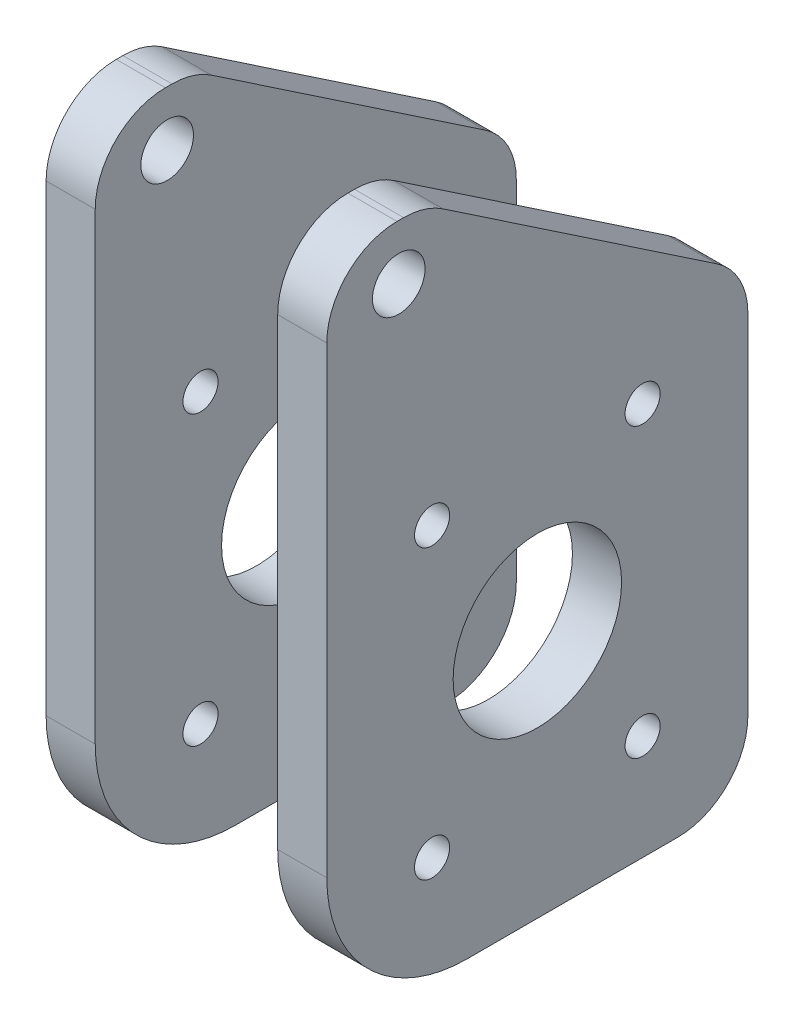
ISO-10303-21;
HEADER;
FILE_DESCRIPTION(('STEP AP214'),'2;1');
FILE_NAME('part.step','',(''),(''),'','','');
FILE_SCHEMA(('AUTOMOTIVE_DESIGN { 1 0 10303 214 1 1 1 1 }'));
ENDSEC;
DATA;
#1=APPLICATION_CONTEXT('core data for automotive mechanical design processes');
#2=APPLICATION_PROTOCOL_DEFINITION('international standard','automotive_design',2000,#1);
#3=PRODUCT_CONTEXT('',#1,'mechanical');
#4=PRODUCT('Part','Part','',(#3));
#5=PRODUCT_RELATED_PRODUCT_CATEGORY('part','',(#4));
#6=PRODUCT_DEFINITION_FORMATION('','',#4);
#7=PRODUCT_DEFINITION_CONTEXT('part definition',#1,'design');
#8=PRODUCT_DEFINITION('design','',#6,#7);
#9=PRODUCT_DEFINITION_SHAPE('','',#8);
#10=(LENGTH_UNIT() NAMED_UNIT(*) SI_UNIT(.MILLI.,.METRE.));
#11=(NAMED_UNIT(*) PLANE_ANGLE_UNIT() SI_UNIT($,.RADIAN.));
#12=(NAMED_UNIT(*) SI_UNIT($,.STERADIAN.) SOLID_ANGLE_UNIT());
#13=UNCERTAINTY_MEASURE_WITH_UNIT(LENGTH_MEASURE(1.E-05),#10,'distance_accuracy_value','');
#14=(GEOMETRIC_REPRESENTATION_CONTEXT(3) GLOBAL_UNCERTAINTY_ASSIGNED_CONTEXT((#13)) GLOBAL_UNIT_ASSIGNED_CONTEXT((#10,
#11,#12)) REPRESENTATION_CONTEXT('',''));
#15=CARTESIAN_POINT('',(0.,0.,0.));
#16=DIRECTION('',(0.,0.,1.));
#17=DIRECTION('',(1.,0.,0.));
#18=AXIS2_PLACEMENT_3D('',#15,#16,#17);
#19=CARTESIAN_POINT('',(2266.95171276937,408.837981043394,480.41287818477));
#20=DIRECTION('',(0.,1.,0.));
#21=DIRECTION('',(0.,0.,1.));
#22=AXIS2_PLACEMENT_3D('',#19,#20,#21);
#23=PLANE('',#22);
#24=DIRECTION('',(1.,0.,0.));
#25=VECTOR('',#24,1.);
#26=CARTESIAN_POINT('',(2266.95171276937,408.837981043394,493.11287818477));
#27=LINE('',#26,#25);
#28=CARTESIAN_POINT('',(2266.95171276937,408.837981043394,493.11287818477));
#29=VERTEX_POINT('',#28);
#30=CARTESIAN_POINT('',(2275.84171276937,408.837981043394,493.11287818477));
#31=VERTEX_POINT('',#30);
#32=EDGE_CURVE('E60',#29,#31,#27,.T.);
#33=ORIENTED_EDGE('',*,*,#32,.T.);
#34=DIRECTION('',(0.,0.,-1.));
#35=VECTOR('',#34,1.);
#36=CARTESIAN_POINT('',(2275.84171276937,408.837981043394,576.51414081052));
#37=LINE('',#36,#35);
#38=CARTESIAN_POINT('',(2275.84171276937,408.837981043394,531.21287818477));
#39=VERTEX_POINT('',#38);
#40=EDGE_CURVE('E12',#39,#31,#37,.T.);
#41=ORIENTED_EDGE('',*,*,#40,.F.);
#42=DIRECTION('',(1.,0.,0.));
#43=VECTOR('',#42,1.);
#44=CARTESIAN_POINT('',(2266.95171276937,408.837981043394,531.21287818477));
#45=LINE('',#44,#43);
#46=CARTESIAN_POINT('',(2266.95171276937,408.837981043394,531.21287818477));
#47=VERTEX_POINT('',#46);
#48=EDGE_CURVE('E143',#39,#47,#45,.F.);
#49=ORIENTED_EDGE('',*,*,#48,.T.);
#50=DIRECTION('',(0.,0.,1.));
#51=VECTOR('',#50,1.);
#52=CARTESIAN_POINT('',(2266.95171276937,408.837981043394,480.41287818477));
#53=LINE('',#52,#51);
#54=EDGE_CURVE('E220',#29,#47,#53,.T.);
#55=ORIENTED_EDGE('',*,*,#54,.F.);
#56=EDGE_LOOP('',(#33,#41,#49,#55));
#57=FACE_BOUND('',#56,.T.);
#58=ADVANCED_FACE('F57',(#57),#23,.F.);
#59=CARTESIAN_POINT('',(2266.95171276937,408.837981043394,556.61287818477));
#60=DIRECTION('',(0.,0.,-1.));
#61=DIRECTION('',(0.,1.,0.));
#62=AXIS2_PLACEMENT_3D('',#59,#60,#61);
#63=PLANE('',#62);
#64=DIRECTION('',(1.,0.,0.));
#65=VECTOR('',#64,1.);
#66=CARTESIAN_POINT('',(2266.95171276937,434.237981043394,556.61287818477));
#67=LINE('',#66,#65);
#68=CARTESIAN_POINT('',(2266.95171276937,434.237981043394,556.61287818477));
#69=VERTEX_POINT('',#68);
#70=CARTESIAN_POINT('',(2275.84171276937,434.237981043394,556.61287818477));
#71=VERTEX_POINT('',#70);
#72=EDGE_CURVE('E136',#69,#71,#67,.T.);
#73=ORIENTED_EDGE('',*,*,#72,.T.);
#74=DIRECTION('',(0.,1.,0.));
#75=VECTOR('',#74,1.);
#76=CARTESIAN_POINT('',(2275.84171276937,408.837981043394,556.61287818477));
#77=LINE('',#76,#75);
#78=CARTESIAN_POINT('',(2275.84171276937,518.057981043394,556.61287818477));
#79=VERTEX_POINT('',#78);
#80=EDGE_CURVE('E127',#71,#79,#77,.T.);
#81=ORIENTED_EDGE('',*,*,#80,.T.);
#82=DIRECTION('',(1.,0.,0.));
#83=VECTOR('',#82,1.);
#84=CARTESIAN_POINT('',(2266.95171276937,518.057981043394,556.61287818477));
#85=LINE('',#84,#83);
#86=CARTESIAN_POINT('',(2266.95171276937,518.057981043394,556.61287818477));
#87=VERTEX_POINT('',#86);
#88=EDGE_CURVE('E135',#79,#87,#85,.F.);
#89=ORIENTED_EDGE('',*,*,#88,.T.);
#90=DIRECTION('',(0.,1.,0.));
#91=VECTOR('',#90,1.);
#92=CARTESIAN_POINT('',(2266.95171276937,408.837981043394,556.61287818477));
#93=LINE('',#92,#91);
#94=EDGE_CURVE('E148',#69,#87,#93,.T.);
#95=ORIENTED_EDGE('',*,*,#94,.F.);
#96=EDGE_LOOP('',(#73,#81,#89,#95));
#97=FACE_BOUND('',#96,.T.);
#98=ADVANCED_FACE('F146',(#97),#63,.F.);
#99=CARTESIAN_POINT('',(2266.95171276937,530.757981043394,556.61287818477));
#100=DIRECTION('',(0.,-1.,0.));
#101=DIRECTION('',(0.,0.,-1.));
#102=AXIS2_PLACEMENT_3D('',#99,#100,#101);
#103=PLANE('',#102);
#104=DIRECTION('',(1.,0.,0.));
#105=VECTOR('',#104,1.);
#106=CARTESIAN_POINT('',(2266.95171276937,530.757981043394,543.91287818477));
#107=LINE('',#106,#105);
#108=CARTESIAN_POINT('',(2266.95171276937,530.757981043394,543.91287818477));
#109=VERTEX_POINT('',#108);
#110=CARTESIAN_POINT('',(2275.84171276937,530.757981043394,543.91287818477));
#111=VERTEX_POINT('',#110);
#112=EDGE_CURVE('E154',#109,#111,#107,.T.);
#113=ORIENTED_EDGE('',*,*,#112,.T.);
#114=DIRECTION('',(0.,0.,-1.));
#115=VECTOR('',#114,1.);
#116=CARTESIAN_POINT('',(2275.84171276937,530.757981043394,576.51414081052));
#117=LINE('',#116,#115);
#118=CARTESIAN_POINT('',(2275.84171276937,530.757981043394,542.712815443371));
#119=VERTEX_POINT('',#118);
#120=EDGE_CURVE('E158',#111,#119,#117,.T.);
#121=ORIENTED_EDGE('',*,*,#120,.T.);
#122=DIRECTION('',(1.,0.,0.));
#123=VECTOR('',#122,1.);
#124=CARTESIAN_POINT('',(2266.95171276937,530.757981043394,542.712815443371));
#125=LINE('',#124,#123);
#126=CARTESIAN_POINT('',(2266.95171276937,530.757981043394,542.712815443371));
#127=VERTEX_POINT('',#126);
#128=EDGE_CURVE('E155',#119,#127,#125,.F.);
#129=ORIENTED_EDGE('',*,*,#128,.T.);
#130=DIRECTION('',(0.,0.,-1.));
#131=VECTOR('',#130,1.);
#132=CARTESIAN_POINT('',(2266.95171276937,530.757981043394,556.61287818477));
#133=LINE('',#132,#131);
#134=EDGE_CURVE('E204',#109,#127,#133,.T.);
#135=ORIENTED_EDGE('',*,*,#134,.F.);
#136=EDGE_LOOP('',(#113,#121,#129,#135));
#137=FACE_BOUND('',#136,.T.);
#138=ADVANCED_FACE('F190',(#137),#103,.F.);
#139=CARTESIAN_POINT('',(2266.95171276937,530.757981043394,538.83287818477));
#140=DIRECTION('',(0.,-0.829266427591158,0.558853462072303));
#141=DIRECTION('',(0.,-0.558853462072303,-0.829266427591158));
#142=AXIS2_PLACEMENT_3D('',#139,#140,#141);
#143=PLANE('',#142);
#144=DIRECTION('',(1.,0.,0.));
#145=VECTOR('',#144,1.);
#146=CARTESIAN_POINT('',(2266.95171276937,528.589664673802,535.615376475052));
#147=LINE('',#146,#145);
#148=CARTESIAN_POINT('',(2266.95171276937,528.589664673802,535.615376475052));
#149=VERTEX_POINT('',#148);
#150=CARTESIAN_POINT('',(2275.84171276937,528.589664673802,535.615376475052));
#151=VERTEX_POINT('',#150);
#152=EDGE_CURVE('E157',#149,#151,#147,.T.);
#153=ORIENTED_EDGE('',*,*,#152,.T.);
#154=DIRECTION('',(0.,-0.558853462072303,-0.829266427591158));
#155=VECTOR('',#154,1.);
#156=CARTESIAN_POINT('',(2275.84171276937,530.757981043394,538.83287818477));
#157=LINE('',#156,#155);
#158=CARTESIAN_POINT('',(2275.84171276937,495.163619999528,486.015439216452));
#159=VERTEX_POINT('',#158);
#160=EDGE_CURVE('E164',#151,#159,#157,.T.);
#161=ORIENTED_EDGE('',*,*,#160,.T.);
#162=DIRECTION('',(1.,0.,0.));
#163=VECTOR('',#162,1.);
#164=CARTESIAN_POINT('',(2266.95171276937,495.163619999528,486.015439216452));
#165=LINE('',#164,#163);
#166=CARTESIAN_POINT('',(2266.95171276937,495.163619999528,486.015439216452));
#167=VERTEX_POINT('',#166);
#168=EDGE_CURVE('E161',#159,#167,#165,.F.);
#169=ORIENTED_EDGE('',*,*,#168,.T.);
#170=DIRECTION('',(0.,-0.558853462072303,-0.829266427591158));
#171=VECTOR('',#170,1.);
#172=CARTESIAN_POINT('',(2266.95171276937,530.757981043394,538.83287818477));
#173=LINE('',#172,#171);
#174=EDGE_CURVE('E203',#149,#167,#173,.T.);
#175=ORIENTED_EDGE('',*,*,#174,.F.);
#176=EDGE_LOOP('',(#153,#161,#169,#175));
#177=FACE_BOUND('',#176,.T.);
#178=ADVANCED_FACE('F275',(#177),#143,.F.);
#179=CARTESIAN_POINT('',(2266.95171276937,491.387981043394,480.41287818477));
#180=DIRECTION('',(0.,0.,1.));
#181=DIRECTION('',(0.,-1.,0.));
#182=AXIS2_PLACEMENT_3D('',#179,#180,#181);
#183=PLANE('',#182);
#184=DIRECTION('',(1.,0.,0.));
#185=VECTOR('',#184,1.);
#186=CARTESIAN_POINT('',(2266.95171276937,484.63193636912,480.41287818477));
#187=LINE('',#186,#185);
#188=CARTESIAN_POINT('',(2266.95171276937,484.63193636912,480.41287818477));
#189=VERTEX_POINT('',#188);
#190=CARTESIAN_POINT('',(2275.84171276937,484.63193636912,480.41287818477));
#191=VERTEX_POINT('',#190);
#192=EDGE_CURVE('E163',#189,#191,#187,.T.);
#193=ORIENTED_EDGE('',*,*,#192,.T.);
#194=DIRECTION('',(0.,-1.,0.));
#195=VECTOR('',#194,1.);
#196=CARTESIAN_POINT('',(2275.84171276937,491.387981043394,480.41287818477));
#197=LINE('',#196,#195);
#198=CARTESIAN_POINT('',(2275.84171276937,421.537981043394,480.41287818477));
#199=VERTEX_POINT('',#198);
#200=EDGE_CURVE('E169',#191,#199,#197,.T.);
#201=ORIENTED_EDGE('',*,*,#200,.T.);
#202=DIRECTION('',(1.,0.,0.));
#203=VECTOR('',#202,1.);
#204=CARTESIAN_POINT('',(2266.95171276937,421.537981043394,480.41287818477));
#205=LINE('',#204,#203);
#206=CARTESIAN_POINT('',(2266.95171276937,421.537981043394,480.41287818477));
#207=VERTEX_POINT('',#206);
#208=EDGE_CURVE('E167',#199,#207,#205,.F.);
#209=ORIENTED_EDGE('',*,*,#208,.T.);
#210=DIRECTION('',(0.,-1.,0.));
#211=VECTOR('',#210,1.);
#212=CARTESIAN_POINT('',(2266.95171276937,491.387981043394,480.41287818477));
#213=LINE('',#212,#211);
#214=EDGE_CURVE('E214',#189,#207,#213,.T.);
#215=ORIENTED_EDGE('',*,*,#214,.F.);
#216=EDGE_LOOP('',(#193,#201,#209,#215));
#217=FACE_BOUND('',#216,.T.);
#218=ADVANCED_FACE('F270',(#217),#183,.F.);
#219=CARTESIAN_POINT('',(2266.95171276937,479.957981043394,537.56287818477));
#220=DIRECTION('',(1.,0.,0.));
#221=DIRECTION('',(0.,0.,-1.));
#222=AXIS2_PLACEMENT_3D('',#219,#220,#221);
#223=CYLINDRICAL_SURFACE('',#222,3.17499999999997);
#224=CARTESIAN_POINT('',(2275.84171276937,479.957981043394,537.56287818477));
#225=DIRECTION('',(-1.,0.,0.));
#226=DIRECTION('',(0.,0.,1.));
#227=AXIS2_PLACEMENT_3D('',#224,#225,#226);
#228=CIRCLE('',#227,3.17499999999997);
#229=CARTESIAN_POINT('',(2275.84171276937,479.957981043394,540.73787818477));
#230=VERTEX_POINT('',#229);
#231=EDGE_CURVE('E240',#230,#230,#228,.T.);
#232=ORIENTED_EDGE('',*,*,#231,.F.);
#233=EDGE_LOOP('',(#232));
#234=FACE_BOUND('',#233,.T.);
#235=CARTESIAN_POINT('',(2266.95171276937,479.957981043394,537.56287818477));
#236=DIRECTION('',(-1.,0.,0.));
#237=DIRECTION('',(0.,0.,1.));
#238=AXIS2_PLACEMENT_3D('',#235,#236,#237);
#239=CIRCLE('',#238,3.17499999999997);
#240=CARTESIAN_POINT('',(2266.95171276937,479.957981043394,540.73787818477));
#241=VERTEX_POINT('',#240);
#242=EDGE_CURVE('E168',#241,#241,#239,.T.);
#243=ORIENTED_EDGE('',*,*,#242,.T.);
#244=EDGE_LOOP('',(#243));
#245=FACE_BOUND('',#244,.T.);
#246=ADVANCED_FACE('F282',(#234,#245),#223,.F.);
#247=CARTESIAN_POINT('',(2266.95171276937,520.821960169238,543.597128474568));
#248=DIRECTION('',(1.,0.,0.));
#249=DIRECTION('',(0.,0.,-1.));
#250=AXIS2_PLACEMENT_3D('',#247,#248,#249);
#251=CYLINDRICAL_SURFACE('',#250,4.76250000000003);
#252=CARTESIAN_POINT('',(2275.84171276937,520.821960169238,543.597128474568));
#253=DIRECTION('',(-1.,0.,0.));
#254=DIRECTION('',(0.,0.,1.));
#255=AXIS2_PLACEMENT_3D('',#252,#253,#254);
#256=CIRCLE('',#255,4.76250000000003);
#257=CARTESIAN_POINT('',(2275.84171276937,520.821960169238,548.359628474568));
#258=VERTEX_POINT('',#257);
#259=EDGE_CURVE('E243',#258,#258,#256,.T.);
#260=ORIENTED_EDGE('',*,*,#259,.F.);
#261=EDGE_LOOP('',(#260));
#262=FACE_BOUND('',#261,.T.);
#263=CARTESIAN_POINT('',(2266.95171276937,520.821960169238,543.597128474568));
#264=DIRECTION('',(-1.,0.,0.));
#265=DIRECTION('',(0.,0.,1.));
#266=AXIS2_PLACEMENT_3D('',#263,#264,#265);
#267=CIRCLE('',#266,4.76250000000003);
#268=CARTESIAN_POINT('',(2266.95171276937,520.821960169238,548.359628474568));
#269=VERTEX_POINT('',#268);
#270=EDGE_CURVE('E226',#269,#269,#267,.T.);
#271=ORIENTED_EDGE('',*,*,#270,.T.);
#272=EDGE_LOOP('',(#271));
#273=FACE_BOUND('',#272,.T.);
#274=ADVANCED_FACE('F303',(#262,#273),#251,.F.);
#275=CARTESIAN_POINT('',(2266.95171276937,427.887981043394,537.56287818477));
#276=DIRECTION('',(1.,0.,0.));
#277=DIRECTION('',(0.,0.,-1.));
#278=AXIS2_PLACEMENT_3D('',#275,#276,#277);
#279=CYLINDRICAL_SURFACE('',#278,3.17499999999997);
#280=CARTESIAN_POINT('',(2275.84171276937,427.887981043394,537.56287818477));
#281=DIRECTION('',(-1.,0.,0.));
#282=DIRECTION('',(0.,0.,1.));
#283=AXIS2_PLACEMENT_3D('',#280,#281,#282);
#284=CIRCLE('',#283,3.17499999999997);
#285=CARTESIAN_POINT('',(2275.84171276937,427.887981043394,540.73787818477));
#286=VERTEX_POINT('',#285);
#287=EDGE_CURVE('E246',#286,#286,#284,.T.);
#288=ORIENTED_EDGE('',*,*,#287,.F.);
#289=EDGE_LOOP('',(#288));
#290=FACE_BOUND('',#289,.T.);
#291=CARTESIAN_POINT('',(2266.95171276937,427.887981043394,537.56287818477));
#292=DIRECTION('',(-1.,0.,0.));
#293=DIRECTION('',(0.,0.,1.));
#294=AXIS2_PLACEMENT_3D('',#291,#292,#293);
#295=CIRCLE('',#294,3.17499999999997);
#296=CARTESIAN_POINT('',(2266.95171276937,427.887981043394,540.73787818477));
#297=VERTEX_POINT('',#296);
#298=EDGE_CURVE('E229',#297,#297,#295,.T.);
#299=ORIENTED_EDGE('',*,*,#298,.T.);
#300=EDGE_LOOP('',(#299));
#301=FACE_BOUND('',#300,.T.);
#302=ADVANCED_FACE('F309',(#290,#301),#279,.F.);
#303=CARTESIAN_POINT('',(2266.95171276937,427.887981043394,499.46287818477));
#304=DIRECTION('',(1.,0.,0.));
#305=DIRECTION('',(0.,0.,-1.));
#306=AXIS2_PLACEMENT_3D('',#303,#304,#305);
#307=CYLINDRICAL_SURFACE('',#306,3.17500000000025);
#308=CARTESIAN_POINT('',(2275.84171276937,427.887981043394,499.46287818477));
#309=DIRECTION('',(-1.,0.,0.));
#310=DIRECTION('',(0.,0.,1.));
#311=AXIS2_PLACEMENT_3D('',#308,#309,#310);
#312=CIRCLE('',#311,3.17500000000025);
#313=CARTESIAN_POINT('',(2275.84171276937,427.887981043394,502.63787818477));
#314=VERTEX_POINT('',#313);
#315=EDGE_CURVE('E249',#314,#314,#312,.T.);
#316=ORIENTED_EDGE('',*,*,#315,.F.);
#317=EDGE_LOOP('',(#316));
#318=FACE_BOUND('',#317,.T.);
#319=CARTESIAN_POINT('',(2266.95171276937,427.887981043394,499.46287818477));
#320=DIRECTION('',(-1.,0.,0.));
#321=DIRECTION('',(0.,0.,1.));
#322=AXIS2_PLACEMENT_3D('',#319,#320,#321);
#323=CIRCLE('',#322,3.17500000000025);
#324=CARTESIAN_POINT('',(2266.95171276937,427.887981043394,502.63787818477));
#325=VERTEX_POINT('',#324);
#326=EDGE_CURVE('E232',#325,#325,#323,.T.);
#327=ORIENTED_EDGE('',*,*,#326,.T.);
#328=EDGE_LOOP('',(#327));
#329=FACE_BOUND('',#328,.T.);
#330=ADVANCED_FACE('F312',(#318,#329),#307,.F.);
#331=CARTESIAN_POINT('',(2266.95171276937,479.957981043394,499.46287818477));
#332=DIRECTION('',(1.,0.,0.));
#333=DIRECTION('',(0.,0.,-1.));
#334=AXIS2_PLACEMENT_3D('',#331,#332,#333);
#335=CYLINDRICAL_SURFACE('',#334,3.17500000000025);
#336=CARTESIAN_POINT('',(2275.84171276937,479.957981043394,499.46287818477));
#337=DIRECTION('',(-1.,0.,0.));
#338=DIRECTION('',(0.,0.,1.));
#339=AXIS2_PLACEMENT_3D('',#336,#337,#338);
#340=CIRCLE('',#339,3.17500000000025);
#341=CARTESIAN_POINT('',(2275.84171276937,479.957981043394,502.63787818477));
#342=VERTEX_POINT('',#341);
#343=EDGE_CURVE('E252',#342,#342,#340,.T.);
#344=ORIENTED_EDGE('',*,*,#343,.F.);
#345=EDGE_LOOP('',(#344));
#346=FACE_BOUND('',#345,.T.);
#347=CARTESIAN_POINT('',(2266.95171276937,479.957981043394,499.46287818477));
#348=DIRECTION('',(-1.,0.,0.));
#349=DIRECTION('',(0.,0.,1.));
#350=AXIS2_PLACEMENT_3D('',#347,#348,#349);
#351=CIRCLE('',#350,3.17500000000025);
#352=CARTESIAN_POINT('',(2266.95171276937,479.957981043394,502.63787818477));
#353=VERTEX_POINT('',#352);
#354=EDGE_CURVE('E235',#353,#353,#351,.T.);
#355=ORIENTED_EDGE('',*,*,#354,.T.);
#356=EDGE_LOOP('',(#355));
#357=FACE_BOUND('',#356,.T.);
#358=ADVANCED_FACE('F319',(#346,#357),#335,.F.);
#359=CARTESIAN_POINT('',(2266.95171276937,453.922981043394,518.51287818477));
#360=DIRECTION('',(1.,0.,0.));
#361=DIRECTION('',(0.,0.,-1.));
#362=AXIS2_PLACEMENT_3D('',#359,#360,#361);
#363=CYLINDRICAL_SURFACE('',#362,15.2400000000001);
#364=CARTESIAN_POINT('',(2275.84171276937,453.922981043394,518.51287818477));
#365=DIRECTION('',(-1.,0.,0.));
#366=DIRECTION('',(0.,0.,1.));
#367=AXIS2_PLACEMENT_3D('',#364,#365,#366);
#368=CIRCLE('',#367,15.2400000000001);
#369=CARTESIAN_POINT('',(2275.84171276937,453.922981043394,533.75287818477));
#370=VERTEX_POINT('',#369);
#371=EDGE_CURVE('E254',#370,#370,#368,.T.);
#372=ORIENTED_EDGE('',*,*,#371,.F.);
#373=EDGE_LOOP('',(#372));
#374=FACE_BOUND('',#373,.T.);
#375=CARTESIAN_POINT('',(2266.95171276937,453.922981043394,518.51287818477));
#376=DIRECTION('',(-1.,0.,0.));
#377=DIRECTION('',(0.,0.,1.));
#378=AXIS2_PLACEMENT_3D('',#375,#376,#377);
#379=CIRCLE('',#378,15.2400000000001);
#380=CARTESIAN_POINT('',(2266.95171276937,453.922981043394,533.75287818477));
#381=VERTEX_POINT('',#380);
#382=EDGE_CURVE('E223',#381,#381,#379,.T.);
#383=ORIENTED_EDGE('',*,*,#382,.T.);
#384=EDGE_LOOP('',(#383));
#385=FACE_BOUND('',#384,.T.);
#386=ADVANCED_FACE('F326',(#374,#385),#363,.F.);
#387=CARTESIAN_POINT('',(2266.95171276937,421.537981043394,493.11287818477));
#388=DIRECTION('',(1.,0.,0.));
#389=DIRECTION('',(0.,0.,-1.));
#390=AXIS2_PLACEMENT_3D('',#387,#388,#389);
#391=CYLINDRICAL_SURFACE('',#390,12.7);
#392=CARTESIAN_POINT('',(2275.84171276937,421.537981043394,493.11287818477));
#393=DIRECTION('',(-1.,0.,0.));
#394=DIRECTION('',(0.,0.,1.));
#395=AXIS2_PLACEMENT_3D('',#392,#393,#394);
#396=CIRCLE('',#395,12.7);
#397=EDGE_CURVE('E179',#31,#199,#396,.F.);
#398=ORIENTED_EDGE('',*,*,#397,.F.);
#399=ORIENTED_EDGE('',*,*,#32,.F.);
#400=CARTESIAN_POINT('',(2266.95171276937,421.537981043394,493.11287818477));
#401=DIRECTION('',(-1.,0.,0.));
#402=DIRECTION('',(0.,0.,1.));
#403=AXIS2_PLACEMENT_3D('',#400,#401,#402);
#404=CIRCLE('',#403,12.7);
#405=EDGE_CURVE('E216',#207,#29,#404,.T.);
#406=ORIENTED_EDGE('',*,*,#405,.F.);
#407=ORIENTED_EDGE('',*,*,#208,.F.);
#408=EDGE_LOOP('',(#398,#399,#406,#407));
#409=FACE_BOUND('',#408,.T.);
#410=ADVANCED_FACE('F262',(#409),#391,.T.);
#411=CARTESIAN_POINT('',(2266.95171276937,484.63193636912,493.11287818477));
#412=DIRECTION('',(1.,0.,0.));
#413=DIRECTION('',(0.,0.,-1.));
#414=AXIS2_PLACEMENT_3D('',#411,#412,#413);
#415=CYLINDRICAL_SURFACE('',#414,12.7);
#416=CARTESIAN_POINT('',(2275.84171276937,484.63193636912,493.11287818477));
#417=DIRECTION('',(-1.,0.,0.));
#418=DIRECTION('',(0.,0.,1.));
#419=AXIS2_PLACEMENT_3D('',#416,#417,#418);
#420=CIRCLE('',#419,12.7);
#421=EDGE_CURVE('E181',#191,#159,#420,.F.);
#422=ORIENTED_EDGE('',*,*,#421,.F.);
#423=ORIENTED_EDGE('',*,*,#192,.F.);
#424=CARTESIAN_POINT('',(2266.95171276937,484.63193636912,493.11287818477));
#425=DIRECTION('',(-1.,0.,0.));
#426=DIRECTION('',(0.,0.,1.));
#427=AXIS2_PLACEMENT_3D('',#424,#425,#426);
#428=CIRCLE('',#427,12.7);
#429=EDGE_CURVE('E206',#167,#189,#428,.T.);
#430=ORIENTED_EDGE('',*,*,#429,.F.);
#431=ORIENTED_EDGE('',*,*,#168,.F.);
#432=EDGE_LOOP('',(#422,#423,#430,#431));
#433=FACE_BOUND('',#432,.T.);
#434=ADVANCED_FACE('F272',(#433),#415,.T.);
#435=CARTESIAN_POINT('',(2266.95171276937,518.057981043394,542.712815443371));
#436=DIRECTION('',(1.,0.,0.));
#437=DIRECTION('',(0.,0.,-1.));
#438=AXIS2_PLACEMENT_3D('',#435,#436,#437);
#439=CYLINDRICAL_SURFACE('',#438,12.7);
#440=CARTESIAN_POINT('',(2275.84171276937,518.057981043394,542.712815443371));
#441=DIRECTION('',(-1.,0.,0.));
#442=DIRECTION('',(0.,0.,1.));
#443=AXIS2_PLACEMENT_3D('',#440,#441,#442);
#444=CIRCLE('',#443,12.7);
#445=EDGE_CURVE('E183',#151,#119,#444,.F.);
#446=ORIENTED_EDGE('',*,*,#445,.F.);
#447=ORIENTED_EDGE('',*,*,#152,.F.);
#448=CARTESIAN_POINT('',(2266.95171276937,518.057981043394,542.712815443371));
#449=DIRECTION('',(-1.,0.,0.));
#450=DIRECTION('',(0.,0.,1.));
#451=AXIS2_PLACEMENT_3D('',#448,#449,#450);
#452=CIRCLE('',#451,12.7);
#453=EDGE_CURVE('E199',#127,#149,#452,.T.);
#454=ORIENTED_EDGE('',*,*,#453,.F.);
#455=ORIENTED_EDGE('',*,*,#128,.F.);
#456=EDGE_LOOP('',(#446,#447,#454,#455));
#457=FACE_BOUND('',#456,.T.);
#458=ADVANCED_FACE('F197',(#457),#439,.T.);
#459=CARTESIAN_POINT('',(2266.95171276937,518.057981043394,543.91287818477));
#460=DIRECTION('',(1.,0.,0.));
#461=DIRECTION('',(0.,0.,-1.));
#462=AXIS2_PLACEMENT_3D('',#459,#460,#461);
#463=CYLINDRICAL_SURFACE('',#462,12.7);
#464=CARTESIAN_POINT('',(2275.84171276937,518.057981043394,543.91287818477));
#465=DIRECTION('',(-1.,0.,0.));
#466=DIRECTION('',(0.,0.,1.));
#467=AXIS2_PLACEMENT_3D('',#464,#465,#466);
#468=CIRCLE('',#467,12.7);
#469=EDGE_CURVE('E131',#111,#79,#468,.F.);
#470=ORIENTED_EDGE('',*,*,#469,.F.);
#471=ORIENTED_EDGE('',*,*,#112,.F.);
#472=CARTESIAN_POINT('',(2266.95171276937,518.057981043394,543.91287818477));
#473=DIRECTION('',(-1.,0.,0.));
#474=DIRECTION('',(0.,0.,1.));
#475=AXIS2_PLACEMENT_3D('',#472,#473,#474);
#476=CIRCLE('',#475,12.7);
#477=EDGE_CURVE('E208',#87,#109,#476,.T.);
#478=ORIENTED_EDGE('',*,*,#477,.F.);
#479=ORIENTED_EDGE('',*,*,#88,.F.);
#480=EDGE_LOOP('',(#470,#471,#478,#479));
#481=FACE_BOUND('',#480,.T.);
#482=ADVANCED_FACE('F354',(#481),#463,.T.);
#483=CARTESIAN_POINT('',(2266.95171276937,434.237981043394,531.21287818477));
#484=DIRECTION('',(1.,0.,0.));
#485=DIRECTION('',(0.,0.,-1.));
#486=AXIS2_PLACEMENT_3D('',#483,#484,#485);
#487=CYLINDRICAL_SURFACE('',#486,25.4);
#488=CARTESIAN_POINT('',(2275.84171276937,434.237981043394,531.21287818477));
#489=DIRECTION('',(-1.,0.,0.));
#490=DIRECTION('',(0.,0.,1.));
#491=AXIS2_PLACEMENT_3D('',#488,#489,#490);
#492=CIRCLE('',#491,25.4);
#493=EDGE_CURVE('E66',#71,#39,#492,.F.);
#494=ORIENTED_EDGE('',*,*,#493,.F.);
#495=ORIENTED_EDGE('',*,*,#72,.F.);
#496=CARTESIAN_POINT('',(2266.95171276937,434.237981043394,531.21287818477));
#497=DIRECTION('',(-1.,0.,0.));
#498=DIRECTION('',(0.,0.,1.));
#499=AXIS2_PLACEMENT_3D('',#496,#497,#498);
#500=CIRCLE('',#499,25.4);
#501=EDGE_CURVE('E219',#47,#69,#500,.T.);
#502=ORIENTED_EDGE('',*,*,#501,.F.);
#503=ORIENTED_EDGE('',*,*,#48,.F.);
#504=EDGE_LOOP('',(#494,#495,#502,#503));
#505=FACE_BOUND('',#504,.T.);
#506=ADVANCED_FACE('F141',(#505),#487,.T.);
#507=CARTESIAN_POINT('',(2266.95171276937,0.,0.));
#508=DIRECTION('',(-1.,0.,0.));
#509=DIRECTION('',(0.,0.,1.));
#510=AXIS2_PLACEMENT_3D('',#507,#508,#509);
#511=PLANE('',#510);
#512=ORIENTED_EDGE('',*,*,#354,.F.);
#513=EDGE_LOOP('',(#512));
#514=FACE_BOUND('',#513,.T.);
#515=ORIENTED_EDGE('',*,*,#298,.F.);
#516=EDGE_LOOP('',(#515));
#517=FACE_BOUND('',#516,.T.);
#518=ORIENTED_EDGE('',*,*,#242,.F.);
#519=EDGE_LOOP('',(#518));
#520=FACE_BOUND('',#519,.T.);
#521=ORIENTED_EDGE('',*,*,#54,.T.);
#522=ORIENTED_EDGE('',*,*,#501,.T.);
#523=ORIENTED_EDGE('',*,*,#94,.T.);
#524=ORIENTED_EDGE('',*,*,#477,.T.);
#525=ORIENTED_EDGE('',*,*,#134,.T.);
#526=ORIENTED_EDGE('',*,*,#453,.T.);
#527=ORIENTED_EDGE('',*,*,#174,.T.);
#528=ORIENTED_EDGE('',*,*,#429,.T.);
#529=ORIENTED_EDGE('',*,*,#214,.T.);
#530=ORIENTED_EDGE('',*,*,#405,.T.);
#531=EDGE_LOOP('',(#521,#522,#523,#524,#525,#526,#527,#528,#529,#530));
#532=FACE_BOUND('',#531,.T.);
#533=ORIENTED_EDGE('',*,*,#270,.F.);
#534=EDGE_LOOP('',(#533));
#535=FACE_BOUND('',#534,.T.);
#536=ORIENTED_EDGE('',*,*,#326,.F.);
#537=EDGE_LOOP('',(#536));
#538=FACE_BOUND('',#537,.T.);
#539=ORIENTED_EDGE('',*,*,#382,.F.);
#540=EDGE_LOOP('',(#539));
#541=FACE_BOUND('',#540,.T.);
#542=ADVANCED_FACE('F266',(#514,#517,#520,#532,#535,#538,#541),#511,.T.);
#543=CARTESIAN_POINT('',(2275.84171276937,530.757981043394,576.51414081052));
#544=DIRECTION('',(-1.,0.,0.));
#545=DIRECTION('',(0.,0.,1.));
#546=AXIS2_PLACEMENT_3D('',#543,#544,#545);
#547=PLANE('',#546);
#548=ORIENTED_EDGE('',*,*,#231,.T.);
#549=EDGE_LOOP('',(#548));
#550=FACE_BOUND('',#549,.T.);
#551=ORIENTED_EDGE('',*,*,#259,.T.);
#552=EDGE_LOOP('',(#551));
#553=FACE_BOUND('',#552,.T.);
#554=ORIENTED_EDGE('',*,*,#287,.T.);
#555=EDGE_LOOP('',(#554));
#556=FACE_BOUND('',#555,.T.);
#557=ORIENTED_EDGE('',*,*,#315,.T.);
#558=EDGE_LOOP('',(#557));
#559=FACE_BOUND('',#558,.T.);
#560=ORIENTED_EDGE('',*,*,#343,.T.);
#561=EDGE_LOOP('',(#560));
#562=FACE_BOUND('',#561,.T.);
#563=ORIENTED_EDGE('',*,*,#371,.T.);
#564=EDGE_LOOP('',(#563));
#565=FACE_BOUND('',#564,.T.);
#566=ORIENTED_EDGE('',*,*,#397,.T.);
#567=ORIENTED_EDGE('',*,*,#200,.F.);
#568=ORIENTED_EDGE('',*,*,#421,.T.);
#569=ORIENTED_EDGE('',*,*,#160,.F.);
#570=ORIENTED_EDGE('',*,*,#445,.T.);
#571=ORIENTED_EDGE('',*,*,#120,.F.);
#572=ORIENTED_EDGE('',*,*,#469,.T.);
#573=ORIENTED_EDGE('',*,*,#80,.F.);
#574=ORIENTED_EDGE('',*,*,#493,.T.);
#575=ORIENTED_EDGE('',*,*,#40,.T.);
#576=EDGE_LOOP('',(#566,#567,#568,#569,#570,#571,#572,#573,#574,#575));
#577=FACE_BOUND('',#576,.T.);
#578=ADVANCED_FACE('F129',(#550,#553,#556,#559,#562,#565,#577),#547,.F.);
#579=CLOSED_SHELL('',(#58,#98,#138,#178,#218,#246,#274,#302,#330,#358,#386,#410,#434,#458,#482,
#506,#542,#578));
#580=MANIFOLD_SOLID_BREP('B2',#579);
#581=CARTESIAN_POINT('',(2266.95171276937,453.922981043394,518.51287818477));
#582=DIRECTION('',(1.,0.,0.));
#583=DIRECTION('',(0.,0.,-1.));
#584=AXIS2_PLACEMENT_3D('',#581,#582,#583);
#585=CYLINDRICAL_SURFACE('',#584,15.2400000000001);
#586=CARTESIAN_POINT('',(2308.86171276937,453.922981043394,518.51287818477));
#587=DIRECTION('',(1.,0.,0.));
#588=DIRECTION('',(0.,0.,-1.));
#589=AXIS2_PLACEMENT_3D('',#586,#587,#588);
#590=CIRCLE('',#589,15.2400000000001);
#591=CARTESIAN_POINT('',(2308.86171276937,453.922981043394,503.27287818477));
#592=VERTEX_POINT('',#591);
#593=EDGE_CURVE('E555',#592,#592,#590,.T.);
#594=ORIENTED_EDGE('',*,*,#593,.F.);
#595=EDGE_LOOP('',(#594));
#596=FACE_BOUND('',#595,.T.);
#597=CARTESIAN_POINT('',(2317.75171276937,453.922981043394,518.51287818477));
#598=DIRECTION('',(-1.,0.,0.));
#599=DIRECTION('',(0.,0.,1.));
#600=AXIS2_PLACEMENT_3D('',#597,#598,#599);
#601=CIRCLE('',#600,15.2400000000001);
#602=CARTESIAN_POINT('',(2317.75171276937,453.922981043394,533.75287818477));
#603=VERTEX_POINT('',#602);
#604=EDGE_CURVE('E660',#603,#603,#601,.T.);
#605=ORIENTED_EDGE('',*,*,#604,.F.);
#606=EDGE_LOOP('',(#605));
#607=FACE_BOUND('',#606,.T.);
#608=ADVANCED_FACE('F471',(#596,#607),#585,.F.);
#609=CARTESIAN_POINT('',(2266.95171276937,479.957981043394,499.46287818477));
#610=DIRECTION('',(1.,0.,0.));
#611=DIRECTION('',(0.,0.,-1.));
#612=AXIS2_PLACEMENT_3D('',#609,#610,#611);
#613=CYLINDRICAL_SURFACE('',#612,3.17500000000025);
#614=CARTESIAN_POINT('',(2308.86171276937,479.957981043394,499.46287818477));
#615=DIRECTION('',(1.,0.,0.));
#616=DIRECTION('',(0.,0.,-1.));
#617=AXIS2_PLACEMENT_3D('',#614,#615,#616);
#618=CIRCLE('',#617,3.17500000000025);
#619=CARTESIAN_POINT('',(2308.86171276937,479.957981043394,496.28787818477));
#620=VERTEX_POINT('',#619);
#621=EDGE_CURVE('E645',#620,#620,#618,.T.);
#622=ORIENTED_EDGE('',*,*,#621,.F.);
#623=EDGE_LOOP('',(#622));
#624=FACE_BOUND('',#623,.T.);
#625=CARTESIAN_POINT('',(2317.75171276937,479.957981043394,499.46287818477));
#626=DIRECTION('',(-1.,0.,0.));
#627=DIRECTION('',(0.,0.,1.));
#628=AXIS2_PLACEMENT_3D('',#625,#626,#627);
#629=CIRCLE('',#628,3.17500000000025);
#630=CARTESIAN_POINT('',(2317.75171276937,479.957981043394,502.63787818477));
#631=VERTEX_POINT('',#630);
#632=EDGE_CURVE('E663',#631,#631,#629,.T.);
#633=ORIENTED_EDGE('',*,*,#632,.F.);
#634=EDGE_LOOP('',(#633));
#635=FACE_BOUND('',#634,.T.);
#636=ADVANCED_FACE('F694',(#624,#635),#613,.F.);
#637=CARTESIAN_POINT('',(2266.95171276937,427.887981043394,499.46287818477));
#638=DIRECTION('',(1.,0.,0.));
#639=DIRECTION('',(0.,0.,-1.));
#640=AXIS2_PLACEMENT_3D('',#637,#638,#639);
#641=CYLINDRICAL_SURFACE('',#640,3.17500000000025);
#642=CARTESIAN_POINT('',(2308.86171276937,427.887981043394,499.46287818477));
#643=DIRECTION('',(1.,0.,0.));
#644=DIRECTION('',(0.,0.,-1.));
#645=AXIS2_PLACEMENT_3D('',#642,#643,#644);
#646=CIRCLE('',#645,3.17500000000025);
#647=CARTESIAN_POINT('',(2308.86171276937,427.887981043394,496.28787818477));
#648=VERTEX_POINT('',#647);
#649=EDGE_CURVE('E648',#648,#648,#646,.T.);
#650=ORIENTED_EDGE('',*,*,#649,.F.);
#651=EDGE_LOOP('',(#650));
#652=FACE_BOUND('',#651,.T.);
#653=CARTESIAN_POINT('',(2317.75171276937,427.887981043394,499.46287818477));
#654=DIRECTION('',(-1.,0.,0.));
#655=DIRECTION('',(0.,0.,1.));
#656=AXIS2_PLACEMENT_3D('',#653,#654,#655);
#657=CIRCLE('',#656,3.17500000000025);
#658=CARTESIAN_POINT('',(2317.75171276937,427.887981043394,502.63787818477));
#659=VERTEX_POINT('',#658);
#660=EDGE_CURVE('E666',#659,#659,#657,.T.);
#661=ORIENTED_EDGE('',*,*,#660,.F.);
#662=EDGE_LOOP('',(#661));
#663=FACE_BOUND('',#662,.T.);
#664=ADVANCED_FACE('F701',(#652,#663),#641,.F.);
#665=CARTESIAN_POINT('',(2266.95171276937,427.887981043394,537.56287818477));
#666=DIRECTION('',(1.,0.,0.));
#667=DIRECTION('',(0.,0.,-1.));
#668=AXIS2_PLACEMENT_3D('',#665,#666,#667);
#669=CYLINDRICAL_SURFACE('',#668,3.17499999999997);
#670=CARTESIAN_POINT('',(2308.86171276937,427.887981043394,537.56287818477));
#671=DIRECTION('',(1.,0.,0.));
#672=DIRECTION('',(0.,0.,-1.));
#673=AXIS2_PLACEMENT_3D('',#670,#671,#672);
#674=CIRCLE('',#673,3.17499999999997);
#675=CARTESIAN_POINT('',(2308.86171276937,427.887981043394,534.38787818477));
#676=VERTEX_POINT('',#675);
#677=EDGE_CURVE('E651',#676,#676,#674,.T.);
#678=ORIENTED_EDGE('',*,*,#677,.F.);
#679=EDGE_LOOP('',(#678));
#680=FACE_BOUND('',#679,.T.);
#681=CARTESIAN_POINT('',(2317.75171276937,427.887981043394,537.56287818477));
#682=DIRECTION('',(-1.,0.,0.));
#683=DIRECTION('',(0.,0.,1.));
#684=AXIS2_PLACEMENT_3D('',#681,#682,#683);
#685=CIRCLE('',#684,3.17499999999997);
#686=CARTESIAN_POINT('',(2317.75171276937,427.887981043394,540.73787818477));
#687=VERTEX_POINT('',#686);
#688=EDGE_CURVE('E669',#687,#687,#685,.T.);
#689=ORIENTED_EDGE('',*,*,#688,.F.);
#690=EDGE_LOOP('',(#689));
#691=FACE_BOUND('',#690,.T.);
#692=ADVANCED_FACE('F689',(#680,#691),#669,.F.);
#693=CARTESIAN_POINT('',(2266.95171276937,520.821960169238,543.597128474568));
#694=DIRECTION('',(1.,0.,0.));
#695=DIRECTION('',(0.,0.,-1.));
#696=AXIS2_PLACEMENT_3D('',#693,#694,#695);
#697=CYLINDRICAL_SURFACE('',#696,4.76250000000003);
#698=CARTESIAN_POINT('',(2308.86171276937,520.821960169238,543.597128474568));
#699=DIRECTION('',(1.,0.,0.));
#700=DIRECTION('',(0.,0.,-1.));
#701=AXIS2_PLACEMENT_3D('',#698,#699,#700);
#702=CIRCLE('',#701,4.76250000000003);
#703=CARTESIAN_POINT('',(2308.86171276937,520.821960169238,538.834628474568));
#704=VERTEX_POINT('',#703);
#705=EDGE_CURVE('E654',#704,#704,#702,.T.);
#706=ORIENTED_EDGE('',*,*,#705,.F.);
#707=EDGE_LOOP('',(#706));
#708=FACE_BOUND('',#707,.T.);
#709=CARTESIAN_POINT('',(2317.75171276937,520.821960169238,543.597128474568));
#710=DIRECTION('',(-1.,0.,0.));
#711=DIRECTION('',(0.,0.,1.));
#712=AXIS2_PLACEMENT_3D('',#709,#710,#711);
#713=CIRCLE('',#712,4.76250000000003);
#714=CARTESIAN_POINT('',(2317.75171276937,520.821960169238,548.359628474568));
#715=VERTEX_POINT('',#714);
#716=EDGE_CURVE('E672',#715,#715,#713,.T.);
#717=ORIENTED_EDGE('',*,*,#716,.F.);
#718=EDGE_LOOP('',(#717));
#719=FACE_BOUND('',#718,.T.);
#720=ADVANCED_FACE('F680',(#708,#719),#697,.F.);
#721=CARTESIAN_POINT('',(2266.95171276937,479.957981043394,537.56287818477));
#722=DIRECTION('',(1.,0.,0.));
#723=DIRECTION('',(0.,0.,-1.));
#724=AXIS2_PLACEMENT_3D('',#721,#722,#723);
#725=CYLINDRICAL_SURFACE('',#724,3.17499999999997);
#726=CARTESIAN_POINT('',(2308.86171276937,479.957981043394,537.56287818477));
#727=DIRECTION('',(1.,0.,0.));
#728=DIRECTION('',(0.,0.,-1.));
#729=AXIS2_PLACEMENT_3D('',#726,#727,#728);
#730=CIRCLE('',#729,3.17499999999997);
#731=CARTESIAN_POINT('',(2308.86171276937,479.957981043394,534.38787818477));
#732=VERTEX_POINT('',#731);
#733=EDGE_CURVE('E657',#732,#732,#730,.T.);
#734=ORIENTED_EDGE('',*,*,#733,.F.);
#735=EDGE_LOOP('',(#734));
#736=FACE_BOUND('',#735,.T.);
#737=CARTESIAN_POINT('',(2317.75171276937,479.957981043394,537.56287818477));
#738=DIRECTION('',(-1.,0.,0.));
#739=DIRECTION('',(0.,0.,1.));
#740=AXIS2_PLACEMENT_3D('',#737,#738,#739);
#741=CIRCLE('',#740,3.17499999999997);
#742=CARTESIAN_POINT('',(2317.75171276937,479.957981043394,540.73787818477));
#743=VERTEX_POINT('',#742);
#744=EDGE_CURVE('E618',#743,#743,#741,.T.);
#745=ORIENTED_EDGE('',*,*,#744,.F.);
#746=EDGE_LOOP('',(#745));
#747=FACE_BOUND('',#746,.T.);
#748=ADVANCED_FACE('F678',(#736,#747),#725,.F.);
#749=CARTESIAN_POINT('',(2317.75171276937,0.,0.));
#750=DIRECTION('',(-1.,0.,0.));
#751=DIRECTION('',(0.,0.,1.));
#752=AXIS2_PLACEMENT_3D('',#749,#750,#751);
#753=PLANE('',#752);
#754=DIRECTION('',(0.,1.,0.));
#755=VECTOR('',#754,1.);
#756=CARTESIAN_POINT('',(2317.75171276937,408.837981043394,556.61287818477));
#757=LINE('',#756,#755);
#758=CARTESIAN_POINT('',(2317.75171276937,434.237981043394,556.61287818477));
#759=VERTEX_POINT('',#758);
#760=CARTESIAN_POINT('',(2317.75171276937,518.057981043394,556.61287818477));
#761=VERTEX_POINT('',#760);
#762=EDGE_CURVE('E605',#759,#761,#757,.T.);
#763=ORIENTED_EDGE('',*,*,#762,.F.);
#764=CARTESIAN_POINT('',(2317.75171276937,434.237981043394,531.21287818477));
#765=DIRECTION('',(-1.,0.,0.));
#766=DIRECTION('',(0.,0.,1.));
#767=AXIS2_PLACEMENT_3D('',#764,#765,#766);
#768=CIRCLE('',#767,25.4);
#769=CARTESIAN_POINT('',(2317.75171276937,408.837981043394,531.21287818477));
#770=VERTEX_POINT('',#769);
#771=EDGE_CURVE('E493',#759,#770,#768,.F.);
#772=ORIENTED_EDGE('',*,*,#771,.T.);
#773=DIRECTION('',(0.,0.,1.));
#774=VECTOR('',#773,1.);
#775=CARTESIAN_POINT('',(2317.75171276937,408.837981043394,480.41287818477));
#776=LINE('',#775,#774);
#777=CARTESIAN_POINT('',(2317.75171276937,408.837981043394,493.11287818477));
#778=VERTEX_POINT('',#777);
#779=EDGE_CURVE('E614',#778,#770,#776,.T.);
#780=ORIENTED_EDGE('',*,*,#779,.F.);
#781=CARTESIAN_POINT('',(2317.75171276937,421.537981043394,493.11287818477));
#782=DIRECTION('',(-1.,0.,0.));
#783=DIRECTION('',(0.,0.,1.));
#784=AXIS2_PLACEMENT_3D('',#781,#782,#783);
#785=CIRCLE('',#784,12.7);
#786=CARTESIAN_POINT('',(2317.75171276937,421.537981043394,480.41287818477));
#787=VERTEX_POINT('',#786);
#788=EDGE_CURVE('E566',#778,#787,#785,.F.);
#789=ORIENTED_EDGE('',*,*,#788,.T.);
#790=DIRECTION('',(0.,-1.,0.));
#791=VECTOR('',#790,1.);
#792=CARTESIAN_POINT('',(2317.75171276937,491.387981043394,480.41287818477));
#793=LINE('',#792,#791);
#794=CARTESIAN_POINT('',(2317.75171276937,484.63193636912,480.41287818477));
#795=VERTEX_POINT('',#794);
#796=EDGE_CURVE('E568',#795,#787,#793,.T.);
#797=ORIENTED_EDGE('',*,*,#796,.F.);
#798=CARTESIAN_POINT('',(2317.75171276937,484.63193636912,493.11287818477));
#799=DIRECTION('',(-1.,0.,0.));
#800=DIRECTION('',(0.,0.,1.));
#801=AXIS2_PLACEMENT_3D('',#798,#799,#800);
#802=CIRCLE('',#801,12.7);
#803=CARTESIAN_POINT('',(2317.75171276937,495.163619999528,486.015439216452));
#804=VERTEX_POINT('',#803);
#805=EDGE_CURVE('E579',#795,#804,#802,.F.);
#806=ORIENTED_EDGE('',*,*,#805,.T.);
#807=DIRECTION('',(0.,-0.558853462072303,-0.829266427591158));
#808=VECTOR('',#807,1.);
#809=CARTESIAN_POINT('',(2317.75171276937,530.757981043394,538.83287818477));
#810=LINE('',#809,#808);
#811=CARTESIAN_POINT('',(2317.75171276937,528.589664673802,535.615376475052));
#812=VERTEX_POINT('',#811);
#813=EDGE_CURVE('E574',#812,#804,#810,.T.);
#814=ORIENTED_EDGE('',*,*,#813,.F.);
#815=CARTESIAN_POINT('',(2317.75171276937,518.057981043394,542.712815443371));
#816=DIRECTION('',(-1.,0.,0.));
#817=DIRECTION('',(0.,0.,1.));
#818=AXIS2_PLACEMENT_3D('',#815,#816,#817);
#819=CIRCLE('',#818,12.7);
#820=CARTESIAN_POINT('',(2317.75171276937,530.757981043394,542.712815443371));
#821=VERTEX_POINT('',#820);
#822=EDGE_CURVE('E571',#812,#821,#819,.F.);
#823=ORIENTED_EDGE('',*,*,#822,.T.);
#824=DIRECTION('',(0.,0.,-1.));
#825=VECTOR('',#824,1.);
#826=CARTESIAN_POINT('',(2317.75171276937,530.757981043394,556.61287818477));
#827=LINE('',#826,#825);
#828=CARTESIAN_POINT('',(2317.75171276937,530.757981043394,543.91287818477));
#829=VERTEX_POINT('',#828);
#830=EDGE_CURVE('E613',#829,#821,#827,.T.);
#831=ORIENTED_EDGE('',*,*,#830,.F.);
#832=CARTESIAN_POINT('',(2317.75171276937,518.057981043394,543.91287818477));
#833=DIRECTION('',(-1.,0.,0.));
#834=DIRECTION('',(0.,0.,1.));
#835=AXIS2_PLACEMENT_3D('',#832,#833,#834);
#836=CIRCLE('',#835,12.7);
#837=EDGE_CURVE('E567',#829,#761,#836,.F.);
#838=ORIENTED_EDGE('',*,*,#837,.T.);
#839=EDGE_LOOP('',(#763,#772,#780,#789,#797,#806,#814,#823,#831,#838));
#840=FACE_BOUND('',#839,.T.);
#841=ORIENTED_EDGE('',*,*,#744,.T.);
#842=EDGE_LOOP('',(#841));
#843=FACE_BOUND('',#842,.T.);
#844=ORIENTED_EDGE('',*,*,#716,.T.);
#845=EDGE_LOOP('',(#844));
#846=FACE_BOUND('',#845,.T.);
#847=ORIENTED_EDGE('',*,*,#688,.T.);
#848=EDGE_LOOP('',(#847));
#849=FACE_BOUND('',#848,.T.);
#850=ORIENTED_EDGE('',*,*,#660,.T.);
#851=EDGE_LOOP('',(#850));
#852=FACE_BOUND('',#851,.T.);
#853=ORIENTED_EDGE('',*,*,#632,.T.);
#854=EDGE_LOOP('',(#853));
#855=FACE_BOUND('',#854,.T.);
#856=ORIENTED_EDGE('',*,*,#604,.T.);
#857=EDGE_LOOP('',(#856));
#858=FACE_BOUND('',#857,.T.);
#859=ADVANCED_FACE('F608',(#840,#843,#846,#849,#852,#855,#858),#753,.F.);
#860=CARTESIAN_POINT('',(2266.95171276937,434.237981043394,531.21287818477));
#861=DIRECTION('',(1.,0.,0.));
#862=DIRECTION('',(0.,0.,-1.));
#863=AXIS2_PLACEMENT_3D('',#860,#861,#862);
#864=CYLINDRICAL_SURFACE('',#863,25.4);
#865=CARTESIAN_POINT('',(2308.86171276937,434.237981043394,531.21287818477));
#866=DIRECTION('',(1.,0.,0.));
#867=DIRECTION('',(0.,0.,-1.));
#868=AXIS2_PLACEMENT_3D('',#865,#866,#867);
#869=CIRCLE('',#868,25.4);
#870=CARTESIAN_POINT('',(2308.86171276937,408.837981043394,531.21287818477));
#871=VERTEX_POINT('',#870);
#872=CARTESIAN_POINT('',(2308.86171276937,434.237981043394,556.61287818477));
#873=VERTEX_POINT('',#872);
#874=EDGE_CURVE('E55',#871,#873,#869,.F.);
#875=ORIENTED_EDGE('',*,*,#874,.F.);
#876=DIRECTION('',(1.,0.,0.));
#877=VECTOR('',#876,1.);
#878=CARTESIAN_POINT('',(2266.95171276937,408.837981043394,531.21287818477));
#879=LINE('',#878,#877);
#880=EDGE_CURVE('E479',#770,#871,#879,.F.);
#881=ORIENTED_EDGE('',*,*,#880,.F.);
#882=ORIENTED_EDGE('',*,*,#771,.F.);
#883=DIRECTION('',(1.,0.,0.));
#884=VECTOR('',#883,1.);
#885=CARTESIAN_POINT('',(2266.95171276937,434.237981043394,556.61287818477));
#886=LINE('',#885,#884);
#887=EDGE_CURVE('E599',#873,#759,#886,.T.);
#888=ORIENTED_EDGE('',*,*,#887,.F.);
#889=EDGE_LOOP('',(#875,#881,#882,#888));
#890=FACE_BOUND('',#889,.T.);
#891=ADVANCED_FACE('F473',(#890),#864,.T.);
#892=CARTESIAN_POINT('',(2266.95171276937,518.057981043394,543.91287818477));
#893=DIRECTION('',(1.,0.,0.));
#894=DIRECTION('',(0.,0.,-1.));
#895=AXIS2_PLACEMENT_3D('',#892,#893,#894);
#896=CYLINDRICAL_SURFACE('',#895,12.7);
#897=CARTESIAN_POINT('',(2308.86171276937,518.057981043394,543.91287818477));
#898=DIRECTION('',(1.,0.,0.));
#899=DIRECTION('',(0.,0.,-1.));
#900=AXIS2_PLACEMENT_3D('',#897,#898,#899);
#901=CIRCLE('',#900,12.7);
#902=CARTESIAN_POINT('',(2308.86171276937,518.057981043394,556.61287818477));
#903=VERTEX_POINT('',#902);
#904=CARTESIAN_POINT('',(2308.86171276937,530.757981043394,543.91287818477));
#905=VERTEX_POINT('',#904);
#906=EDGE_CURVE('E762',#903,#905,#901,.F.);
#907=ORIENTED_EDGE('',*,*,#906,.F.);
#908=DIRECTION('',(1.,0.,0.));
#909=VECTOR('',#908,1.);
#910=CARTESIAN_POINT('',(2266.95171276937,518.057981043394,556.61287818477));
#911=LINE('',#910,#909);
#912=EDGE_CURVE('E596',#761,#903,#911,.F.);
#913=ORIENTED_EDGE('',*,*,#912,.F.);
#914=ORIENTED_EDGE('',*,*,#837,.F.);
#915=DIRECTION('',(1.,0.,0.));
#916=VECTOR('',#915,1.);
#917=CARTESIAN_POINT('',(2266.95171276937,530.757981043394,543.91287818477));
#918=LINE('',#917,#916);
#919=EDGE_CURVE('E591',#905,#829,#918,.T.);
#920=ORIENTED_EDGE('',*,*,#919,.F.);
#921=EDGE_LOOP('',(#907,#913,#914,#920));
#922=FACE_BOUND('',#921,.T.);
#923=ADVANCED_FACE('F753',(#922),#896,.T.);
#924=CARTESIAN_POINT('',(2266.95171276937,518.057981043394,542.712815443371));
#925=DIRECTION('',(1.,0.,0.));
#926=DIRECTION('',(0.,0.,-1.));
#927=AXIS2_PLACEMENT_3D('',#924,#925,#926);
#928=CYLINDRICAL_SURFACE('',#927,12.7);
#929=CARTESIAN_POINT('',(2308.86171276937,518.057981043394,542.712815443371));
#930=DIRECTION('',(1.,0.,0.));
#931=DIRECTION('',(0.,0.,-1.));
#932=AXIS2_PLACEMENT_3D('',#929,#930,#931);
#933=CIRCLE('',#932,12.7);
#934=CARTESIAN_POINT('',(2308.86171276937,530.757981043394,542.712815443371));
#935=VERTEX_POINT('',#934);
#936=CARTESIAN_POINT('',(2308.86171276937,528.589664673802,535.615376475052));
#937=VERTEX_POINT('',#936);
#938=EDGE_CURVE('E639',#935,#937,#933,.F.);
#939=ORIENTED_EDGE('',*,*,#938,.F.);
#940=DIRECTION('',(1.,0.,0.));
#941=VECTOR('',#940,1.);
#942=CARTESIAN_POINT('',(2266.95171276937,530.757981043394,542.712815443371));
#943=LINE('',#942,#941);
#944=EDGE_CURVE('E593',#821,#935,#943,.F.);
#945=ORIENTED_EDGE('',*,*,#944,.F.);
#946=ORIENTED_EDGE('',*,*,#822,.F.);
#947=DIRECTION('',(1.,0.,0.));
#948=VECTOR('',#947,1.);
#949=CARTESIAN_POINT('',(2266.95171276937,528.589664673802,535.615376475052));
#950=LINE('',#949,#948);
#951=EDGE_CURVE('E586',#937,#812,#950,.T.);
#952=ORIENTED_EDGE('',*,*,#951,.F.);
#953=EDGE_LOOP('',(#939,#945,#946,#952));
#954=FACE_BOUND('',#953,.T.);
#955=ADVANCED_FACE('F751',(#954),#928,.T.);
#956=CARTESIAN_POINT('',(2266.95171276937,484.63193636912,493.11287818477));
#957=DIRECTION('',(1.,0.,0.));
#958=DIRECTION('',(0.,0.,-1.));
#959=AXIS2_PLACEMENT_3D('',#956,#957,#958);
#960=CYLINDRICAL_SURFACE('',#959,12.7);
#961=CARTESIAN_POINT('',(2308.86171276937,484.63193636912,493.11287818477));
#962=DIRECTION('',(1.,0.,0.));
#963=DIRECTION('',(0.,0.,-1.));
#964=AXIS2_PLACEMENT_3D('',#961,#962,#963);
#965=CIRCLE('',#964,12.7);
#966=CARTESIAN_POINT('',(2308.86171276937,495.163619999528,486.015439216452));
#967=VERTEX_POINT('',#966);
#968=CARTESIAN_POINT('',(2308.86171276937,484.63193636912,480.41287818477));
#969=VERTEX_POINT('',#968);
#970=EDGE_CURVE('E635',#967,#969,#965,.F.);
#971=ORIENTED_EDGE('',*,*,#970,.F.);
#972=DIRECTION('',(1.,0.,0.));
#973=VECTOR('',#972,1.);
#974=CARTESIAN_POINT('',(2266.95171276937,495.163619999528,486.015439216452));
#975=LINE('',#974,#973);
#976=EDGE_CURVE('E588',#804,#967,#975,.F.);
#977=ORIENTED_EDGE('',*,*,#976,.F.);
#978=ORIENTED_EDGE('',*,*,#805,.F.);
#979=DIRECTION('',(1.,0.,0.));
#980=VECTOR('',#979,1.);
#981=CARTESIAN_POINT('',(2266.95171276937,484.63193636912,480.41287818477));
#982=LINE('',#981,#980);
#983=EDGE_CURVE('E582',#969,#795,#982,.T.);
#984=ORIENTED_EDGE('',*,*,#983,.F.);
#985=EDGE_LOOP('',(#971,#977,#978,#984));
#986=FACE_BOUND('',#985,.T.);
#987=ADVANCED_FACE('F632',(#986),#960,.T.);
#988=CARTESIAN_POINT('',(2266.95171276937,421.537981043394,493.11287818477));
#989=DIRECTION('',(1.,0.,0.));
#990=DIRECTION('',(0.,0.,-1.));
#991=AXIS2_PLACEMENT_3D('',#988,#989,#990);
#992=CYLINDRICAL_SURFACE('',#991,12.7);
#993=CARTESIAN_POINT('',(2308.86171276937,421.537981043394,493.11287818477));
#994=DIRECTION('',(1.,0.,0.));
#995=DIRECTION('',(0.,0.,-1.));
#996=AXIS2_PLACEMENT_3D('',#993,#994,#995);
#997=CIRCLE('',#996,12.7);
#998=CARTESIAN_POINT('',(2308.86171276937,421.537981043394,480.41287818477));
#999=VERTEX_POINT('',#998);
#1000=CARTESIAN_POINT('',(2308.86171276937,408.837981043394,493.11287818477));
#1001=VERTEX_POINT('',#1000);
#1002=EDGE_CURVE('E547',#999,#1001,#997,.F.);
#1003=ORIENTED_EDGE('',*,*,#1002,.F.);
#1004=DIRECTION('',(1.,0.,0.));
#1005=VECTOR('',#1004,1.);
#1006=CARTESIAN_POINT('',(2266.95171276937,421.537981043394,480.41287818477));
#1007=LINE('',#1006,#1005);
#1008=EDGE_CURVE('E584',#787,#999,#1007,.F.);
#1009=ORIENTED_EDGE('',*,*,#1008,.F.);
#1010=ORIENTED_EDGE('',*,*,#788,.F.);
#1011=DIRECTION('',(1.,0.,0.));
#1012=VECTOR('',#1011,1.);
#1013=CARTESIAN_POINT('',(2266.95171276937,408.837981043394,493.11287818477));
#1014=LINE('',#1013,#1012);
#1015=EDGE_CURVE('E560',#1001,#778,#1014,.T.);
#1016=ORIENTED_EDGE('',*,*,#1015,.F.);
#1017=EDGE_LOOP('',(#1003,#1009,#1010,#1016));
#1018=FACE_BOUND('',#1017,.T.);
#1019=ADVANCED_FACE('F565',(#1018),#992,.T.);
#1020=CARTESIAN_POINT('',(2266.95171276937,491.387981043394,480.41287818477));
#1021=DIRECTION('',(0.,0.,1.));
#1022=DIRECTION('',(0.,-1.,0.));
#1023=AXIS2_PLACEMENT_3D('',#1020,#1021,#1022);
#1024=PLANE('',#1023);
#1025=ORIENTED_EDGE('',*,*,#1008,.T.);
#1026=DIRECTION('',(0.,1.,0.));
#1027=VECTOR('',#1026,1.);
#1028=CARTESIAN_POINT('',(2308.86171276937,491.387981043394,480.41287818477));
#1029=LINE('',#1028,#1027);
#1030=EDGE_CURVE('E550',#999,#969,#1029,.T.);
#1031=ORIENTED_EDGE('',*,*,#1030,.T.);
#1032=ORIENTED_EDGE('',*,*,#983,.T.);
#1033=ORIENTED_EDGE('',*,*,#796,.T.);
#1034=EDGE_LOOP('',(#1025,#1031,#1032,#1033));
#1035=FACE_BOUND('',#1034,.T.);
#1036=ADVANCED_FACE('F748',(#1035),#1024,.F.);
#1037=CARTESIAN_POINT('',(2266.95171276937,530.757981043394,538.83287818477));
#1038=DIRECTION('',(0.,-0.829266427591158,0.558853462072303));
#1039=DIRECTION('',(0.,-0.558853462072303,-0.829266427591158));
#1040=AXIS2_PLACEMENT_3D('',#1037,#1038,#1039);
#1041=PLANE('',#1040);
#1042=ORIENTED_EDGE('',*,*,#976,.T.);
#1043=DIRECTION('',(0.,0.558853462072303,0.829266427591158));
#1044=VECTOR('',#1043,1.);
#1045=CARTESIAN_POINT('',(2308.86171276937,530.757981043394,538.83287818477));
#1046=LINE('',#1045,#1044);
#1047=EDGE_CURVE('E636',#967,#937,#1046,.T.);
#1048=ORIENTED_EDGE('',*,*,#1047,.T.);
#1049=ORIENTED_EDGE('',*,*,#951,.T.);
#1050=ORIENTED_EDGE('',*,*,#813,.T.);
#1051=EDGE_LOOP('',(#1042,#1048,#1049,#1050));
#1052=FACE_BOUND('',#1051,.T.);
#1053=ADVANCED_FACE('F625',(#1052),#1041,.F.);
#1054=CARTESIAN_POINT('',(2266.95171276937,530.757981043394,556.61287818477));
#1055=DIRECTION('',(0.,-1.,0.));
#1056=DIRECTION('',(0.,0.,-1.));
#1057=AXIS2_PLACEMENT_3D('',#1054,#1055,#1056);
#1058=PLANE('',#1057);
#1059=ORIENTED_EDGE('',*,*,#944,.T.);
#1060=DIRECTION('',(0.,0.,1.));
#1061=VECTOR('',#1060,1.);
#1062=CARTESIAN_POINT('',(2308.86171276937,530.757981043394,478.829931241631));
#1063=LINE('',#1062,#1061);
#1064=EDGE_CURVE('E563',#935,#905,#1063,.T.);
#1065=ORIENTED_EDGE('',*,*,#1064,.T.);
#1066=ORIENTED_EDGE('',*,*,#919,.T.);
#1067=ORIENTED_EDGE('',*,*,#830,.T.);
#1068=EDGE_LOOP('',(#1059,#1065,#1066,#1067));
#1069=FACE_BOUND('',#1068,.T.);
#1070=ADVANCED_FACE('F742',(#1069),#1058,.F.);
#1071=CARTESIAN_POINT('',(2266.95171276937,408.837981043394,556.61287818477));
#1072=DIRECTION('',(0.,0.,-1.));
#1073=DIRECTION('',(0.,1.,0.));
#1074=AXIS2_PLACEMENT_3D('',#1071,#1072,#1073);
#1075=PLANE('',#1074);
#1076=ORIENTED_EDGE('',*,*,#912,.T.);
#1077=DIRECTION('',(0.,-1.,0.));
#1078=VECTOR('',#1077,1.);
#1079=CARTESIAN_POINT('',(2308.86171276937,408.837981043394,556.61287818477));
#1080=LINE('',#1079,#1078);
#1081=EDGE_CURVE('E606',#903,#873,#1080,.T.);
#1082=ORIENTED_EDGE('',*,*,#1081,.T.);
#1083=ORIENTED_EDGE('',*,*,#887,.T.);
#1084=ORIENTED_EDGE('',*,*,#762,.T.);
#1085=EDGE_LOOP('',(#1076,#1082,#1083,#1084));
#1086=FACE_BOUND('',#1085,.T.);
#1087=ADVANCED_FACE('F604',(#1086),#1075,.F.);
#1088=CARTESIAN_POINT('',(2266.95171276937,408.837981043394,480.41287818477));
#1089=DIRECTION('',(0.,1.,0.));
#1090=DIRECTION('',(0.,0.,1.));
#1091=AXIS2_PLACEMENT_3D('',#1088,#1089,#1090);
#1092=PLANE('',#1091);
#1093=ORIENTED_EDGE('',*,*,#880,.T.);
#1094=DIRECTION('',(0.,0.,1.));
#1095=VECTOR('',#1094,1.);
#1096=CARTESIAN_POINT('',(2308.86171276937,408.837981043394,478.829931241631));
#1097=LINE('',#1096,#1095);
#1098=EDGE_CURVE('E485',#1001,#871,#1097,.T.);
#1099=ORIENTED_EDGE('',*,*,#1098,.F.);
#1100=ORIENTED_EDGE('',*,*,#1015,.T.);
#1101=ORIENTED_EDGE('',*,*,#779,.T.);
#1102=EDGE_LOOP('',(#1093,#1099,#1100,#1101));
#1103=FACE_BOUND('',#1102,.T.);
#1104=ADVANCED_FACE('F559',(#1103),#1092,.F.);
#1105=CARTESIAN_POINT('',(2308.86171276937,530.757981043394,478.829931241631));
#1106=DIRECTION('',(1.,0.,0.));
#1107=DIRECTION('',(0.,0.,-1.));
#1108=AXIS2_PLACEMENT_3D('',#1105,#1106,#1107);
#1109=PLANE('',#1108);
#1110=ORIENTED_EDGE('',*,*,#733,.T.);
#1111=EDGE_LOOP('',(#1110));
#1112=FACE_BOUND('',#1111,.T.);
#1113=ORIENTED_EDGE('',*,*,#705,.T.);
#1114=EDGE_LOOP('',(#1113));
#1115=FACE_BOUND('',#1114,.T.);
#1116=ORIENTED_EDGE('',*,*,#677,.T.);
#1117=EDGE_LOOP('',(#1116));
#1118=FACE_BOUND('',#1117,.T.);
#1119=ORIENTED_EDGE('',*,*,#649,.T.);
#1120=EDGE_LOOP('',(#1119));
#1121=FACE_BOUND('',#1120,.T.);
#1122=ORIENTED_EDGE('',*,*,#621,.T.);
#1123=EDGE_LOOP('',(#1122));
#1124=FACE_BOUND('',#1123,.T.);
#1125=ORIENTED_EDGE('',*,*,#593,.T.);
#1126=EDGE_LOOP('',(#1125));
#1127=FACE_BOUND('',#1126,.T.);
#1128=ORIENTED_EDGE('',*,*,#1002,.T.);
#1129=ORIENTED_EDGE('',*,*,#1098,.T.);
#1130=ORIENTED_EDGE('',*,*,#874,.T.);
#1131=ORIENTED_EDGE('',*,*,#1081,.F.);
#1132=ORIENTED_EDGE('',*,*,#906,.T.);
#1133=ORIENTED_EDGE('',*,*,#1064,.F.);
#1134=ORIENTED_EDGE('',*,*,#938,.T.);
#1135=ORIENTED_EDGE('',*,*,#1047,.F.);
#1136=ORIENTED_EDGE('',*,*,#970,.T.);
#1137=ORIENTED_EDGE('',*,*,#1030,.F.);
#1138=EDGE_LOOP('',(#1128,#1129,#1130,#1131,#1132,#1133,#1134,#1135,#1136,#1137));
#1139=FACE_BOUND('',#1138,.T.);
#1140=ADVANCED_FACE('F548',(#1112,#1115,#1118,#1121,#1124,#1127,#1139),#1109,.F.);
#1141=CLOSED_SHELL('',(#608,#636,#664,#692,#720,#748,#859,#891,#923,#955,#987,#1019,#1036,#1053,
#1070,#1087,#1104,#1140));
#1142=MANIFOLD_SOLID_BREP('B6',#1141);
#1143=ADVANCED_BREP_SHAPE_REPRESENTATION('',(#18,#580,#1142),#14);
#1144=SHAPE_DEFINITION_REPRESENTATION(#9,#1143);
ENDSEC;
END-ISO-10303-21;
